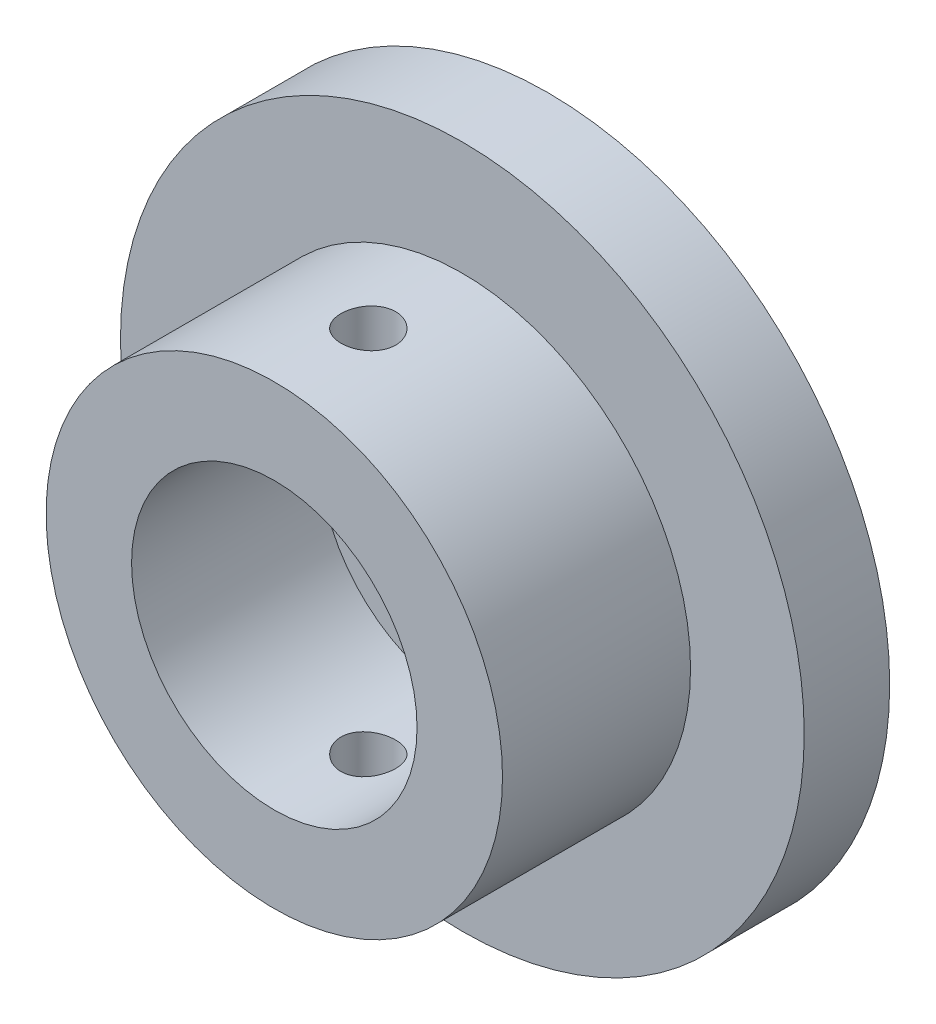
ISO-10303-21;
HEADER;
FILE_DESCRIPTION(('STEP AP214'),'2;1');
FILE_NAME('part.step','',(''),(''),'','','');
FILE_SCHEMA(('AUTOMOTIVE_DESIGN { 1 0 10303 214 1 1 1 1 }'));
ENDSEC;
DATA;
#1=APPLICATION_CONTEXT('core data for automotive mechanical design processes');
#2=APPLICATION_PROTOCOL_DEFINITION('international standard','automotive_design',2000,#1);
#3=PRODUCT_CONTEXT('',#1,'mechanical');
#4=PRODUCT('Part','Part','',(#3));
#5=PRODUCT_RELATED_PRODUCT_CATEGORY('part','',(#4));
#6=PRODUCT_DEFINITION_FORMATION('','',#4);
#7=PRODUCT_DEFINITION_CONTEXT('part definition',#1,'design');
#8=PRODUCT_DEFINITION('design','',#6,#7);
#9=PRODUCT_DEFINITION_SHAPE('','',#8);
#10=(LENGTH_UNIT() NAMED_UNIT(*) SI_UNIT(.MILLI.,.METRE.));
#11=(NAMED_UNIT(*) PLANE_ANGLE_UNIT() SI_UNIT($,.RADIAN.));
#12=(NAMED_UNIT(*) SI_UNIT($,.STERADIAN.) SOLID_ANGLE_UNIT());
#13=UNCERTAINTY_MEASURE_WITH_UNIT(LENGTH_MEASURE(1.E-05),#10,'distance_accuracy_value','');
#14=(GEOMETRIC_REPRESENTATION_CONTEXT(3) GLOBAL_UNCERTAINTY_ASSIGNED_CONTEXT((#13)) GLOBAL_UNIT_ASSIGNED_CONTEXT((#10,
#11,#12)) REPRESENTATION_CONTEXT('',''));
#15=CARTESIAN_POINT('',(0.,0.,0.));
#16=DIRECTION('',(0.,0.,1.));
#17=DIRECTION('',(1.,0.,0.));
#18=AXIS2_PLACEMENT_3D('',#15,#16,#17);
#19=CARTESIAN_POINT('',(0.,0.,5.));
#20=DIRECTION('',(0.,0.,-1.));
#21=DIRECTION('',(-1.,0.,0.));
#22=AXIS2_PLACEMENT_3D('',#19,#20,#21);
#23=CYLINDRICAL_SURFACE('',#22,20.);
#24=CARTESIAN_POINT('',(0.,0.,5.));
#25=DIRECTION('',(0.,0.,1.));
#26=DIRECTION('',(1.,0.,0.));
#27=AXIS2_PLACEMENT_3D('',#24,#25,#26);
#28=CIRCLE('',#27,20.);
#29=CARTESIAN_POINT('',(20.,0.,5.));
#30=VERTEX_POINT('',#29);
#31=EDGE_CURVE('E50',#30,#30,#28,.T.);
#32=ORIENTED_EDGE('',*,*,#31,.F.);
#33=EDGE_LOOP('',(#32));
#34=FACE_BOUND('',#33,.T.);
#35=CARTESIAN_POINT('',(0.,0.,0.));
#36=DIRECTION('',(0.,0.,1.));
#37=DIRECTION('',(1.,0.,0.));
#38=AXIS2_PLACEMENT_3D('',#35,#36,#37);
#39=CIRCLE('',#38,20.);
#40=CARTESIAN_POINT('',(20.,0.,0.));
#41=VERTEX_POINT('',#40);
#42=EDGE_CURVE('E56',#41,#41,#39,.T.);
#43=ORIENTED_EDGE('',*,*,#42,.T.);
#44=EDGE_LOOP('',(#43));
#45=FACE_BOUND('',#44,.T.);
#46=ADVANCED_FACE('F37',(#34,#45),#23,.T.);
#47=CARTESIAN_POINT('',(0.,0.,5.));
#48=DIRECTION('',(0.,0.,1.));
#49=DIRECTION('',(1.,0.,0.));
#50=AXIS2_PLACEMENT_3D('',#47,#48,#49);
#51=PLANE('',#50);
#52=CARTESIAN_POINT('',(0.,0.,5.));
#53=DIRECTION('',(0.,0.,1.));
#54=DIRECTION('',(1.,0.,0.));
#55=AXIS2_PLACEMENT_3D('',#52,#53,#54);
#56=CIRCLE('',#55,13.35);
#57=CARTESIAN_POINT('',(13.35,0.,5.));
#58=VERTEX_POINT('',#57);
#59=EDGE_CURVE('E129',#58,#58,#56,.T.);
#60=ORIENTED_EDGE('',*,*,#59,.F.);
#61=EDGE_LOOP('',(#60));
#62=FACE_BOUND('',#61,.T.);
#63=ORIENTED_EDGE('',*,*,#31,.T.);
#64=EDGE_LOOP('',(#63));
#65=FACE_BOUND('',#64,.T.);
#66=ADVANCED_FACE('F103',(#62,#65),#51,.T.);
#67=CARTESIAN_POINT('',(0.,0.,0.));
#68=DIRECTION('',(0.,0.,1.));
#69=DIRECTION('',(1.,0.,0.));
#70=AXIS2_PLACEMENT_3D('',#67,#68,#69);
#71=PLANE('',#70);
#72=CARTESIAN_POINT('',(0.,0.,0.));
#73=DIRECTION('',(0.,0.,-1.));
#74=DIRECTION('',(-1.,0.,0.));
#75=AXIS2_PLACEMENT_3D('',#72,#73,#74);
#76=CIRCLE('',#75,12.9034879005639);
#77=CARTESIAN_POINT('',(-12.9034879005639,0.,0.));
#78=VERTEX_POINT('',#77);
#79=EDGE_CURVE('E91',#78,#78,#76,.T.);
#80=ORIENTED_EDGE('',*,*,#79,.F.);
#81=EDGE_LOOP('',(#80));
#82=FACE_BOUND('',#81,.T.);
#83=ORIENTED_EDGE('',*,*,#42,.F.);
#84=EDGE_LOOP('',(#83));
#85=FACE_BOUND('',#84,.T.);
#86=ADVANCED_FACE('F106',(#82,#85),#71,.F.);
#87=CARTESIAN_POINT('',(0.,0.,16.));
#88=DIRECTION('',(0.,0.,1.));
#89=DIRECTION('',(1.,0.,0.));
#90=AXIS2_PLACEMENT_3D('',#87,#88,#89);
#91=PLANE('',#90);
#92=CARTESIAN_POINT('',(0.,0.,16.));
#93=DIRECTION('',(0.,0.,1.));
#94=DIRECTION('',(1.,0.,0.));
#95=AXIS2_PLACEMENT_3D('',#92,#93,#94);
#96=CIRCLE('',#95,13.35);
#97=CARTESIAN_POINT('',(13.35,0.,16.));
#98=VERTEX_POINT('',#97);
#99=EDGE_CURVE('E126',#98,#98,#96,.T.);
#100=ORIENTED_EDGE('',*,*,#99,.T.);
#101=EDGE_LOOP('',(#100));
#102=FACE_BOUND('',#101,.T.);
#103=CARTESIAN_POINT('',(0.,0.,16.));
#104=DIRECTION('',(0.,0.,1.));
#105=DIRECTION('',(1.,0.,0.));
#106=AXIS2_PLACEMENT_3D('',#103,#104,#105);
#107=CIRCLE('',#106,8.35);
#108=CARTESIAN_POINT('',(8.35,0.,16.));
#109=VERTEX_POINT('',#108);
#110=EDGE_CURVE('E134',#109,#109,#107,.T.);
#111=ORIENTED_EDGE('',*,*,#110,.F.);
#112=EDGE_LOOP('',(#111));
#113=FACE_BOUND('',#112,.T.);
#114=ADVANCED_FACE('F101',(#102,#113),#91,.T.);
#115=CARTESIAN_POINT('',(0.,0.,16.));
#116=DIRECTION('',(0.,0.,-1.));
#117=DIRECTION('',(-1.,0.,0.));
#118=AXIS2_PLACEMENT_3D('',#115,#116,#117);
#119=CYLINDRICAL_SURFACE('',#118,13.35);
#120=CARTESIAN_POINT('',(0.,-13.35,12.1));
#121=CARTESIAN_POINT('',(0.08952834844518,-13.3499987936479,12.0999961786977));
#122=CARTESIAN_POINT('',(0.179113370539221,-13.3490898771944,12.0924603046261));
#123=CARTESIAN_POINT('',(0.355792629559645,-13.3455514505529,12.0625160181489));
#124=CARTESIAN_POINT('',(0.442884131949133,-13.3429201216303,12.0400918845319));
#125=CARTESIAN_POINT('',(0.611992819855896,-13.3362334372356,11.9810394637834));
#126=CARTESIAN_POINT('',(0.694013301746952,-13.3321790185254,11.9444205188635));
#127=CARTESIAN_POINT('',(0.850728374997732,-13.3230976288697,11.8580378932761));
#128=CARTESIAN_POINT('',(0.925424264355072,-13.3180708307114,11.8082765473789));
#129=CARTESIAN_POINT('',(1.06576531991648,-13.3075777851692,11.6967512367392));
#130=CARTESIAN_POINT('',(1.13136794053488,-13.302109649709,11.6349339058635));
#131=CARTESIAN_POINT('',(1.25129397541818,-13.2913655313018,11.5011658563929));
#132=CARTESIAN_POINT('',(1.30561682723396,-13.2860895579475,11.4292146327864));
#133=CARTESIAN_POINT('',(1.40159821894524,-13.27630842812,11.2769467801532));
#134=CARTESIAN_POINT('',(1.44321717324154,-13.2718056997797,11.1966050291177));
#135=CARTESIAN_POINT('',(1.51235657306163,-13.264105512013,11.0300097556512));
#136=CARTESIAN_POINT('',(1.53987751106424,-13.2609080069927,10.9437564398454));
#137=CARTESIAN_POINT('',(1.57991100120593,-13.2561981625569,10.7682265849757));
#138=CARTESIAN_POINT('',(1.59249515183172,-13.2546777864368,10.67896659491));
#139=CARTESIAN_POINT('',(1.60251934982912,-13.2534696846962,10.4995896545425));
#140=CARTESIAN_POINT('',(1.59995995875207,-13.25378189112,10.409472736141));
#141=CARTESIAN_POINT('',(1.57982855037575,-13.2561963259811,10.231437786817));
#142=CARTESIAN_POINT('',(1.56233524524869,-13.2582891690239,10.1435107101426));
#143=CARTESIAN_POINT('',(1.51295531464243,-13.2640144259593,9.97184926574479));
#144=CARTESIAN_POINT('',(1.48106841911193,-13.2676468687377,9.88811497671881));
#145=CARTESIAN_POINT('',(1.40372134750049,-13.2760527221886,9.72697056544406));
#146=CARTESIAN_POINT('',(1.35822680642899,-13.2808290154006,9.64957709440325));
#147=CARTESIAN_POINT('',(1.25498047373705,-13.290982133195,9.50349364031692));
#148=CARTESIAN_POINT('',(1.19722816654972,-13.2963589830326,9.43480402355337));
#149=CARTESIAN_POINT('',(1.07066869011866,-13.3071491293924,9.30762113501134));
#150=CARTESIAN_POINT('',(1.00179364519536,-13.3125624405245,9.24919538621962));
#151=CARTESIAN_POINT('',(0.855177949699856,-13.3227835587139,9.14472393664219));
#152=CARTESIAN_POINT('',(0.777437281392028,-13.3275913645598,9.09867826062336));
#153=CARTESIAN_POINT('',(0.615246222507605,-13.336062410831,9.0202745932169));
#154=CARTESIAN_POINT('',(0.530793856240847,-13.3397253126595,8.98792065005772));
#155=CARTESIAN_POINT('',(0.35760150731483,-13.3454907006994,8.93787153684925));
#156=CARTESIAN_POINT('',(0.268861709272369,-13.3475932540358,8.9201757362147));
#157=CARTESIAN_POINT('',(0.0901975327176722,-13.3499923443044,8.90003232641368));
#158=CARTESIAN_POINT('',(0.000283787374595168,-13.350299902173,8.89749166539563));
#159=CARTESIAN_POINT('',(-0.178688197782501,-13.3491040587092,8.90748535090659));
#160=CARTESIAN_POINT('',(-0.267746454279792,-13.347600692765,8.92001940285281));
#161=CARTESIAN_POINT('',(-0.442206199993488,-13.3429588230607,8.9597294377028));
#162=CARTESIAN_POINT('',(-0.527617890050847,-13.339825255133,8.98686123083461));
#163=CARTESIAN_POINT('',(-0.692678655190031,-13.332273956285,9.0549507525386));
#164=CARTESIAN_POINT('',(-0.772327549000742,-13.3278561849915,9.09590891579552));
#165=CARTESIAN_POINT('',(-0.924018513346013,-13.3182018770222,9.19071491835944));
#166=CARTESIAN_POINT('',(-0.996022586213507,-13.3129615445552,9.24462316140195));
#167=CARTESIAN_POINT('',(-1.12999382556217,-13.3022606829901,9.36371335539218));
#168=CARTESIAN_POINT('',(-1.19196062671689,-13.2968001458862,9.42889571650537));
#169=CARTESIAN_POINT('',(-1.30442688755913,-13.2862404921048,9.56909289694407));
#170=CARTESIAN_POINT('',(-1.35486479964829,-13.2811434108184,9.64415726526891));
#171=CARTESIAN_POINT('',(-1.44241681039877,-13.2719207363343,9.80174634321919));
#172=CARTESIAN_POINT('',(-1.47953115778828,-13.2677951250014,9.8842709135394));
#173=CARTESIAN_POINT('',(-1.53928209137435,-13.2609961505335,10.0542364503129));
#174=CARTESIAN_POINT('',(-1.56195380666959,-13.2583192660384,10.1416649203907));
#175=CARTESIAN_POINT('',(-1.59228923997413,-13.2547105649497,10.3191219466423));
#176=CARTESIAN_POINT('',(-1.59995359545786,-13.2537786742332,10.409150392211));
#177=CARTESIAN_POINT('',(-1.60004569183104,-13.2537675073664,10.5886396288879));
#178=CARTESIAN_POINT('',(-1.59257012039954,-13.2546764749949,10.6781003851194));
#179=CARTESIAN_POINT('',(-1.56279886218971,-13.2582193796073,10.8544844285159));
#180=CARTESIAN_POINT('',(-1.54050316998635,-13.2608533172227,10.941407714752));
#181=CARTESIAN_POINT('',(-1.48175402551803,-13.2675458325214,11.1102393004767));
#182=CARTESIAN_POINT('',(-1.44530483318323,-13.2716039815093,11.1921491003488));
#183=CARTESIAN_POINT('',(-1.35929290729016,-13.2806884153047,11.3487050504849));
#184=CARTESIAN_POINT('',(-1.30973006202858,-13.2857147083589,11.4233511388686));
#185=CARTESIAN_POINT('',(-1.19853784991209,-13.2962075714811,11.5637553966588));
#186=CARTESIAN_POINT('',(-1.13683638458679,-13.301676651347,11.6294562840468));
#187=CARTESIAN_POINT('',(-1.00326774659578,-13.3124165006522,11.7496095636469));
#188=CARTESIAN_POINT('',(-0.931398172766001,-13.3176872228766,11.8040592914419));
#189=CARTESIAN_POINT('',(-0.779246629750587,-13.3274566949094,11.9003250152497));
#190=CARTESIAN_POINT('',(-0.698936046880937,-13.3319526730621,11.9420960427533));
#191=CARTESIAN_POINT('',(-0.532432727268812,-13.3396376620964,12.0115002347943));
#192=CARTESIAN_POINT('',(-0.446246554249135,-13.3428281043836,12.0391488915768));
#193=CARTESIAN_POINT('',(-0.299670591712782,-13.3467661149264,12.0728430607927));
#194=CARTESIAN_POINT('',(-0.240208159709908,-13.3479729709225,12.0830124405512));
#195=CARTESIAN_POINT('',(-0.120505708496943,-13.349590316865,12.0965921740643));
#196=CARTESIAN_POINT('',(-0.0602656944063414,-13.3500008120517,12.1000025722963));
#197=CARTESIAN_POINT('',(0.,-13.35,12.1));
#198=B_SPLINE_CURVE_WITH_KNOTS('',3,(#120,#121,#122,#123,#124,#125,#126,#127,#128,#129,#130,
#131,#132,#133,#134,#135,#136,#137,#138,#139,#140,#141,#142,#143,#144,#145,#146,#147,#148,#149,
#150,#151,#152,#153,#154,#155,#156,#157,#158,#159,#160,#161,#162,#163,#164,#165,#166,#167,#168,
#169,#170,#171,#172,#173,#174,#175,#176,#177,#178,#179,#180,#181,#182,#183,#184,#185,#186,#187,
#188,#189,#190,#191,#192,#193,#194,#195,#196,#197),.UNSPECIFIED.,.T.,.F.,(4,2,2,2,2,2,2,2,2,2,2,
2,2,2,2,2,2,2,2,2,2,2,2,2,2,2,2,2,2,2,2,2,2,2,2,2,2,2,4),(0.,0.268364928420798,
0.537013687606326,0.805485936943893,1.07391052376643,1.34355143222059,1.61320578269599,
1.8836920001261,2.15416876815464,2.42334371962502,2.69250868963865,2.96026366946738,
3.22802367310044,3.49646567547782,3.76491897087897,4.03507710135868,4.30523577229761,
4.57547426521419,4.84570113201509,5.11426709647259,5.38282781282827,5.65058008843578,
5.91834078264235,6.18737552273611,6.45642005268497,6.7268689857465,6.99731286972582,
7.26709641047308,7.53686849125378,7.80492316740225,8.07297794167447,8.34095209909425,
8.60892853921639,8.87854751381376,9.14823026461351,9.41885863394076,9.68918948279137,
9.86983958384796,10.0504884961362),.UNSPECIFIED.);
#199=CARTESIAN_POINT('',(0.,-13.35,12.1));
#200=VERTEX_POINT('',#199);
#201=EDGE_CURVE('E90',#200,#200,#198,.T.);
#202=ORIENTED_EDGE('',*,*,#201,.T.);
#203=EDGE_LOOP('',(#202));
#204=FACE_BOUND('',#203,.T.);
#205=CARTESIAN_POINT('',(0.,13.35,12.1));
#206=CARTESIAN_POINT('',(-0.0895283484451774,13.3499987936479,12.0999961786977));
#207=CARTESIAN_POINT('',(-0.179113370539218,13.3490898771944,12.0924603046261));
#208=CARTESIAN_POINT('',(-0.355792629559642,13.3455514505529,12.0625160181489));
#209=CARTESIAN_POINT('',(-0.44288413194913,13.3429201216303,12.0400918845319));
#210=CARTESIAN_POINT('',(-0.611992819855893,13.3362334372356,11.9810394637834));
#211=CARTESIAN_POINT('',(-0.694013301746949,13.3321790185254,11.9444205188635));
#212=CARTESIAN_POINT('',(-0.850728374997729,13.3230976288697,11.8580378932761));
#213=CARTESIAN_POINT('',(-0.925424264355069,13.3180708307114,11.8082765473789));
#214=CARTESIAN_POINT('',(-1.06576531991648,13.3075777851692,11.6967512367392));
#215=CARTESIAN_POINT('',(-1.13136794053488,13.302109649709,11.6349339058635));
#216=CARTESIAN_POINT('',(-1.25129397541818,13.2913655313018,11.5011658563929));
#217=CARTESIAN_POINT('',(-1.30561682723396,13.2860895579475,11.4292146327864));
#218=CARTESIAN_POINT('',(-1.40159821894524,13.27630842812,11.2769467801532));
#219=CARTESIAN_POINT('',(-1.44321717324154,13.2718056997797,11.1966050291177));
#220=CARTESIAN_POINT('',(-1.51235657306162,13.264105512013,11.0300097556512));
#221=CARTESIAN_POINT('',(-1.53987751106423,13.2609080069927,10.9437564398454));
#222=CARTESIAN_POINT('',(-1.57991100120592,13.2561981625569,10.7682265849757));
#223=CARTESIAN_POINT('',(-1.59249515183171,13.2546777864368,10.67896659491));
#224=CARTESIAN_POINT('',(-1.60251934982912,13.2534696846962,10.4995896545425));
#225=CARTESIAN_POINT('',(-1.59995995875207,13.25378189112,10.409472736141));
#226=CARTESIAN_POINT('',(-1.57982855037575,13.2561963259811,10.231437786817));
#227=CARTESIAN_POINT('',(-1.56233524524869,13.2582891690239,10.1435107101426));
#228=CARTESIAN_POINT('',(-1.51295531464243,13.2640144259593,9.97184926574479));
#229=CARTESIAN_POINT('',(-1.48106841911193,13.2676468687377,9.88811497671881));
#230=CARTESIAN_POINT('',(-1.40372134750049,13.2760527221886,9.72697056544406));
#231=CARTESIAN_POINT('',(-1.35822680642899,13.2808290154006,9.64957709440325));
#232=CARTESIAN_POINT('',(-1.25498047373705,13.290982133195,9.50349364031692));
#233=CARTESIAN_POINT('',(-1.19722816654972,13.2963589830326,9.43480402355337));
#234=CARTESIAN_POINT('',(-1.07066869011865,13.3071491293924,9.30762113501134));
#235=CARTESIAN_POINT('',(-1.00179364519535,13.3125624405245,9.24919538621962));
#236=CARTESIAN_POINT('',(-0.855177949699854,13.3227835587139,9.14472393664219));
#237=CARTESIAN_POINT('',(-0.777437281392025,13.3275913645598,9.09867826062336));
#238=CARTESIAN_POINT('',(-0.615246222507603,13.336062410831,9.0202745932169));
#239=CARTESIAN_POINT('',(-0.530793856240844,13.3397253126595,8.98792065005772));
#240=CARTESIAN_POINT('',(-0.357601507314827,13.3454907006994,8.93787153684925));
#241=CARTESIAN_POINT('',(-0.268861709272366,13.3475932540358,8.9201757362147));
#242=CARTESIAN_POINT('',(-0.0901975327176695,13.3499923443044,8.90003232641368));
#243=CARTESIAN_POINT('',(-0.000283787374592471,13.350299902173,8.89749166539563));
#244=CARTESIAN_POINT('',(0.178688197782503,13.3491040587092,8.90748535090659));
#245=CARTESIAN_POINT('',(0.267746454279794,13.347600692765,8.92001940285281));
#246=CARTESIAN_POINT('',(0.44220619999349,13.3429588230607,8.9597294377028));
#247=CARTESIAN_POINT('',(0.52761789005085,13.339825255133,8.98686123083461));
#248=CARTESIAN_POINT('',(0.692678655190034,13.332273956285,9.0549507525386));
#249=CARTESIAN_POINT('',(0.772327549000745,13.3278561849915,9.09590891579552));
#250=CARTESIAN_POINT('',(0.924018513346016,13.3182018770222,9.19071491835944));
#251=CARTESIAN_POINT('',(0.996022586213509,13.3129615445552,9.24462316140195));
#252=CARTESIAN_POINT('',(1.12999382556218,13.3022606829901,9.36371335539218));
#253=CARTESIAN_POINT('',(1.19196062671689,13.2968001458861,9.42889571650537));
#254=CARTESIAN_POINT('',(1.30442688755914,13.2862404921048,9.56909289694407));
#255=CARTESIAN_POINT('',(1.3548647996483,13.2811434108184,9.64415726526891));
#256=CARTESIAN_POINT('',(1.44241681039877,13.2719207363343,9.80174634321919));
#257=CARTESIAN_POINT('',(1.47953115778828,13.2677951250014,9.8842709135394));
#258=CARTESIAN_POINT('',(1.53928209137435,13.2609961505335,10.0542364503129));
#259=CARTESIAN_POINT('',(1.56195380666959,13.2583192660384,10.1416649203907));
#260=CARTESIAN_POINT('',(1.59228923997414,13.2547105649497,10.3191219466423));
#261=CARTESIAN_POINT('',(1.59995359545787,13.2537786742332,10.409150392211));
#262=CARTESIAN_POINT('',(1.60004569183104,13.2537675073664,10.5886396288879));
#263=CARTESIAN_POINT('',(1.59257012039954,13.2546764749949,10.6781003851194));
#264=CARTESIAN_POINT('',(1.56279886218972,13.2582193796073,10.8544844285159));
#265=CARTESIAN_POINT('',(1.54050316998636,13.2608533172227,10.941407714752));
#266=CARTESIAN_POINT('',(1.48175402551803,13.2675458325214,11.1102393004767));
#267=CARTESIAN_POINT('',(1.44530483318323,13.2716039815093,11.1921491003488));
#268=CARTESIAN_POINT('',(1.35929290729017,13.2806884153047,11.3487050504849));
#269=CARTESIAN_POINT('',(1.30973006202859,13.2857147083589,11.4233511388686));
#270=CARTESIAN_POINT('',(1.19853784991209,13.2962075714811,11.5637553966588));
#271=CARTESIAN_POINT('',(1.13683638458679,13.301676651347,11.6294562840468));
#272=CARTESIAN_POINT('',(1.00326774659579,13.3124165006522,11.7496095636469));
#273=CARTESIAN_POINT('',(0.931398172766002,13.3176872228766,11.8040592914419));
#274=CARTESIAN_POINT('',(0.779246629750589,13.3274566949094,11.9003250152497));
#275=CARTESIAN_POINT('',(0.698936046880938,13.3319526730621,11.9420960427533));
#276=CARTESIAN_POINT('',(0.532432727268814,13.3396376620964,12.0115002347943));
#277=CARTESIAN_POINT('',(0.446246554249137,13.3428281043836,12.0391488915768));
#278=CARTESIAN_POINT('',(0.299670591712784,13.3467661149264,12.0728430607927));
#279=CARTESIAN_POINT('',(0.240208159709909,13.3479729709225,12.0830124405512));
#280=CARTESIAN_POINT('',(0.120505708496944,13.349590316865,12.0965921740643));
#281=CARTESIAN_POINT('',(0.0602656944063436,13.3500008120517,12.1000025722963));
#282=CARTESIAN_POINT('',(0.,13.35,12.1));
#283=B_SPLINE_CURVE_WITH_KNOTS('',3,(#205,#206,#207,#208,#209,#210,#211,#212,#213,#214,#215,
#216,#217,#218,#219,#220,#221,#222,#223,#224,#225,#226,#227,#228,#229,#230,#231,#232,#233,#234,
#235,#236,#237,#238,#239,#240,#241,#242,#243,#244,#245,#246,#247,#248,#249,#250,#251,#252,#253,
#254,#255,#256,#257,#258,#259,#260,#261,#262,#263,#264,#265,#266,#267,#268,#269,#270,#271,#272,
#273,#274,#275,#276,#277,#278,#279,#280,#281,#282),.UNSPECIFIED.,.T.,.F.,(4,2,2,2,2,2,2,2,2,2,2,
2,2,2,2,2,2,2,2,2,2,2,2,2,2,2,2,2,2,2,2,2,2,2,2,2,2,2,4),(0.,0.268364928420798,
0.537013687606326,0.805485936943893,1.07391052376643,1.34355143222059,1.61320578269599,
1.8836920001261,2.15416876815464,2.42334371962502,2.69250868963865,2.96026366946738,
3.22802367310044,3.49646567547782,3.76491897087897,4.03507710135868,4.30523577229761,
4.57547426521419,4.84570113201509,5.11426709647259,5.38282781282827,5.65058008843578,
5.91834078264235,6.18737552273611,6.45642005268497,6.7268689857465,6.99731286972583,
7.26709641047308,7.53686849125378,7.80492316740225,8.07297794167447,8.34095209909425,
8.6089285392164,8.87854751381376,9.14823026461351,9.41885863394076,9.68918948279138,
9.86983958384796,10.0504884961362),.UNSPECIFIED.);
#284=CARTESIAN_POINT('',(0.,13.35,12.1));
#285=VERTEX_POINT('',#284);
#286=EDGE_CURVE('E82',#285,#285,#283,.T.);
#287=ORIENTED_EDGE('',*,*,#286,.T.);
#288=EDGE_LOOP('',(#287));
#289=FACE_BOUND('',#288,.T.);
#290=ORIENTED_EDGE('',*,*,#99,.F.);
#291=EDGE_LOOP('',(#290));
#292=FACE_BOUND('',#291,.T.);
#293=ORIENTED_EDGE('',*,*,#59,.T.);
#294=EDGE_LOOP('',(#293));
#295=FACE_BOUND('',#294,.T.);
#296=ADVANCED_FACE('F97',(#204,#289,#292,#295),#119,.T.);
#297=CARTESIAN_POINT('',(0.,0.,16.));
#298=DIRECTION('',(0.,0.,-1.));
#299=DIRECTION('',(-1.,0.,0.));
#300=AXIS2_PLACEMENT_3D('',#297,#298,#299);
#301=CYLINDRICAL_SURFACE('',#300,8.35);
#302=CARTESIAN_POINT('',(0.,-8.35,12.1));
#303=CARTESIAN_POINT('',(0.088999920412338,-8.34999837671798,12.099996638553));
#304=CARTESIAN_POINT('',(0.178043169954566,-8.34856240490577,12.0925489829305));
#305=CARTESIAN_POINT('',(0.353617996851197,-8.34297246864219,12.0629757627956));
#306=CARTESIAN_POINT('',(0.440147432574108,-8.33881625373756,12.0408380450051));
#307=CARTESIAN_POINT('',(0.608130266925262,-8.32825049076629,11.9825894593916));
#308=CARTESIAN_POINT('',(0.689588259758564,-8.32184301812952,11.9464914584486));
#309=CARTESIAN_POINT('',(0.845284689432195,-8.3074734148694,11.8613840782446));
#310=CARTESIAN_POINT('',(0.919523660016036,-8.2995113993134,11.8123756545202));
#311=CARTESIAN_POINT('',(1.05960823569186,-8.28279958916938,11.7021894987275));
#312=CARTESIAN_POINT('',(1.12535071545626,-8.27404198190622,11.6408818304469));
#313=CARTESIAN_POINT('',(1.2456837220506,-8.25678363879897,11.5081169355528));
#314=CARTESIAN_POINT('',(1.30027342575777,-8.24828292195392,11.4366589604625));
#315=CARTESIAN_POINT('',(1.39718344110446,-8.23242479224726,11.2848888842238));
#316=CARTESIAN_POINT('',(1.43939824239803,-8.225077446011,11.2045082667941));
#317=CARTESIAN_POINT('',(1.50968453374201,-8.21246831940417,11.0376313307637));
#318=CARTESIAN_POINT('',(1.53775730035106,-8.20720635080203,10.9511355649628));
#319=CARTESIAN_POINT('',(1.57863043704444,-8.19944252786857,10.7755890527733));
#320=CARTESIAN_POINT('',(1.59161100789495,-8.19690813407764,10.6865817310867));
#321=CARTESIAN_POINT('',(1.60249074083646,-8.19478836277369,10.5076192447866));
#322=CARTESIAN_POINT('',(1.60039131626055,-8.19520270889769,10.4176641697878));
#323=CARTESIAN_POINT('',(1.58131663553811,-8.19890399567156,10.2406693362248));
#324=CARTESIAN_POINT('',(1.56454682405781,-8.20215126227161,10.1536064843604));
#325=CARTESIAN_POINT('',(1.51693118667707,-8.21109013859066,9.9835532816138));
#326=CARTESIAN_POINT('',(1.48608473863151,-8.21678185634642,9.90056311091135));
#327=CARTESIAN_POINT('',(1.41099206390459,-8.2300095013322,9.74041285983158));
#328=CARTESIAN_POINT('',(1.36666337439718,-8.23755672152345,9.66329241666184));
#329=CARTESIAN_POINT('',(1.26592282133831,-8.25363759316322,9.51750723087783));
#330=CARTESIAN_POINT('',(1.20950967894696,-8.26217134896806,9.44884338439691));
#331=CARTESIAN_POINT('',(1.08509639451126,-8.27943630331606,9.32073399544455));
#332=CARTESIAN_POINT('',(1.01692065016761,-8.28816843828946,9.26145898343637));
#333=CARTESIAN_POINT('',(0.871503710083373,-8.3047171889267,9.15516078213957));
#334=CARTESIAN_POINT('',(0.794262415640826,-8.3125337946208,9.10813772626315));
#335=CARTESIAN_POINT('',(0.632725367371713,-8.32638762045492,9.0276510597155));
#336=CARTESIAN_POINT('',(0.548420274870845,-8.33242243576898,8.99420575189077));
#337=CARTESIAN_POINT('',(0.375246985053417,-8.34201425025046,8.94199941271068));
#338=CARTESIAN_POINT('',(0.286379295526278,-8.34557152451412,8.92323675102451));
#339=CARTESIAN_POINT('',(0.108070023162961,-8.34976949207204,8.90116698054494));
#340=CARTESIAN_POINT('',(0.0186583533189865,-8.35045425636979,8.89762630970143));
#341=CARTESIAN_POINT('',(-0.159479275013742,-8.34895200457526,8.90547371249381));
#342=CARTESIAN_POINT('',(-0.248205268516609,-8.34676513611094,8.91686101869627));
#343=CARTESIAN_POINT('',(-0.421708027256872,-8.33979282495598,8.95404699091678));
#344=CARTESIAN_POINT('',(-0.506511172410959,-8.33502879769411,8.97972693933648));
#345=CARTESIAN_POINT('',(-0.670608206968542,-8.32343421571049,9.04464036039672));
#346=CARTESIAN_POINT('',(-0.749901709058058,-8.31660351588726,9.0838747847272));
#347=CARTESIAN_POINT('',(-0.901721601237373,-8.30152337442907,9.17529660944378));
#348=CARTESIAN_POINT('',(-0.974160915357745,-8.29325870198987,9.22762604850601));
#349=CARTESIAN_POINT('',(-1.1093138798415,-8.27626551513524,9.34356091256803));
#350=CARTESIAN_POINT('',(-1.17202657772992,-8.26753695540607,9.4071674405668));
#351=CARTESIAN_POINT('',(-1.28683813149658,-8.25045278966988,9.54491023660484));
#352=CARTESIAN_POINT('',(-1.33877728330101,-8.24210405690218,9.61918061757127));
#353=CARTESIAN_POINT('',(-1.42944294129684,-8.22686545533228,9.77552913197211));
#354=CARTESIAN_POINT('',(-1.46816995151533,-8.21997553088212,9.85760696740886));
#355=CARTESIAN_POINT('',(-1.53108827864681,-8.20848909682197,10.0268437135403));
#356=CARTESIAN_POINT('',(-1.55535146885927,-8.20388126675669,10.1139750989029));
#357=CARTESIAN_POINT('',(-1.58887393343417,-8.19745546664984,10.2911748190823));
#358=CARTESIAN_POINT('',(-1.59813498480968,-8.19563716618804,10.3812428047676));
#359=CARTESIAN_POINT('',(-1.6013287760233,-8.19501357400432,10.560158132435));
#360=CARTESIAN_POINT('',(-1.59551357064302,-8.19615873656897,10.6490008994876));
#361=CARTESIAN_POINT('',(-1.56927319302119,-8.20122290683066,10.8244172460686));
#362=CARTESIAN_POINT('',(-1.54884811742649,-8.20514189617837,10.910990840604));
#363=CARTESIAN_POINT('',(-1.49407612783588,-8.21529086511451,11.0792677442711));
#364=CARTESIAN_POINT('',(-1.45975767685212,-8.2215161177185,11.1609806212307));
#365=CARTESIAN_POINT('',(-1.37820110436923,-8.23557931144187,11.3175287484828));
#366=CARTESIAN_POINT('',(-1.33096201446157,-8.24341737343123,11.3923634826931));
#367=CARTESIAN_POINT('',(-1.22403378469916,-8.25997612354642,11.5342912244519));
#368=CARTESIAN_POINT('',(-1.16416165696249,-8.26870868846733,11.6012450075807));
#369=CARTESIAN_POINT('',(-1.03404728203711,-8.28598482897628,11.7242393421252));
#370=CARTESIAN_POINT('',(-0.963802656128361,-8.29452836069528,11.7802773833844));
#371=CARTESIAN_POINT('',(-0.814139702476404,-8.3105588527926,11.8803469256546));
#372=CARTESIAN_POINT('',(-0.734640822720126,-8.31803504487452,11.9242597380767));
#373=CARTESIAN_POINT('',(-0.56927441498169,-8.33098309751287,11.9980347500145));
#374=CARTESIAN_POINT('',(-0.483412877295726,-8.33645681523278,12.027909975822));
#375=CARTESIAN_POINT('',(-0.331098108478749,-8.34368411722474,12.0667857920298));
#376=CARTESIAN_POINT('',(-0.265528024217639,-8.34603904201679,12.0792195391437));
#377=CARTESIAN_POINT('',(-0.133313378124885,-8.34919757014,12.0958277889749));
#378=CARTESIAN_POINT('',(-0.0666688457878886,-8.35000121598242,12.1000025180224));
#379=CARTESIAN_POINT('',(0.,-8.35,12.1));
#380=B_SPLINE_CURVE_WITH_KNOTS('',3,(#302,#303,#304,#305,#306,#307,#308,#309,#310,#311,#312,
#313,#314,#315,#316,#317,#318,#319,#320,#321,#322,#323,#324,#325,#326,#327,#328,#329,#330,#331,
#332,#333,#334,#335,#336,#337,#338,#339,#340,#341,#342,#343,#344,#345,#346,#347,#348,#349,#350,
#351,#352,#353,#354,#355,#356,#357,#358,#359,#360,#361,#362,#363,#364,#365,#366,#367,#368,#369,
#370,#371,#372,#373,#374,#375,#376,#377,#378,#379),.UNSPECIFIED.,.T.,.F.,(4,2,2,2,2,2,2,2,2,2,2,
2,2,2,2,2,2,2,2,2,2,2,2,2,2,2,2,2,2,2,2,2,2,2,2,2,2,2,4),(0.,0.266755922641982,
0.533732811508008,0.800464217954758,1.06717588840782,1.3368696127265,1.60658323441526,
1.87853371263834,2.1504596383147,2.41910429900525,2.68772378200666,2.95264066233248,
3.21756925232387,3.48415200015084,3.75076297310503,4.02176686755232,4.29277371285183,
4.56414467279092,4.83548549597961,5.10264773818341,5.36979624636324,5.63475818546357,
5.89973873191361,6.16772849195322,6.43574447823537,6.7074870784977,6.97921931095168,
7.24958975143671,7.51992816402523,7.78577613719329,8.05162235174689,8.31692666786249,
8.58225087412411,8.8517205011012,9.12125202167133,9.39333520362083,9.66516540270863,
9.86499475950792,10.064818640105),.UNSPECIFIED.);
#381=CARTESIAN_POINT('',(0.,-8.35,12.1));
#382=VERTEX_POINT('',#381);
#383=EDGE_CURVE('E40',#382,#382,#380,.T.);
#384=ORIENTED_EDGE('',*,*,#383,.F.);
#385=EDGE_LOOP('',(#384));
#386=FACE_BOUND('',#385,.T.);
#387=CARTESIAN_POINT('',(0.,8.35,12.1));
#388=CARTESIAN_POINT('',(-0.0889999204123354,8.34999837671798,12.099996638553));
#389=CARTESIAN_POINT('',(-0.178043169954563,8.34856240490577,12.0925489829305));
#390=CARTESIAN_POINT('',(-0.353617996851194,8.34297246864219,12.0629757627956));
#391=CARTESIAN_POINT('',(-0.440147432574105,8.33881625373756,12.0408380450051));
#392=CARTESIAN_POINT('',(-0.60813026692526,8.32825049076629,11.9825894593916));
#393=CARTESIAN_POINT('',(-0.689588259758562,8.32184301812952,11.9464914584486));
#394=CARTESIAN_POINT('',(-0.845284689432192,8.3074734148694,11.8613840782446));
#395=CARTESIAN_POINT('',(-0.919523660016033,8.2995113993134,11.8123756545202));
#396=CARTESIAN_POINT('',(-1.05960823569186,8.28279958916938,11.7021894987275));
#397=CARTESIAN_POINT('',(-1.12535071545626,8.27404198190622,11.6408818304469));
#398=CARTESIAN_POINT('',(-1.24568372205059,8.25678363879897,11.5081169355528));
#399=CARTESIAN_POINT('',(-1.30027342575776,8.24828292195392,11.4366589604625));
#400=CARTESIAN_POINT('',(-1.39718344110445,8.23242479224726,11.2848888842238));
#401=CARTESIAN_POINT('',(-1.43939824239803,8.225077446011,11.2045082667941));
#402=CARTESIAN_POINT('',(-1.50968453374201,8.21246831940417,11.0376313307637));
#403=CARTESIAN_POINT('',(-1.53775730035106,8.20720635080203,10.9511355649628));
#404=CARTESIAN_POINT('',(-1.57863043704444,8.19944252786856,10.7755890527733));
#405=CARTESIAN_POINT('',(-1.59161100789495,8.19690813407764,10.6865817310867));
#406=CARTESIAN_POINT('',(-1.60249074083646,8.19478836277369,10.5076192447866));
#407=CARTESIAN_POINT('',(-1.60039131626055,8.19520270889769,10.4176641697878));
#408=CARTESIAN_POINT('',(-1.58131663553811,8.19890399567156,10.2406693362248));
#409=CARTESIAN_POINT('',(-1.56454682405781,8.20215126227161,10.1536064843604));
#410=CARTESIAN_POINT('',(-1.51693118667706,8.21109013859066,9.9835532816138));
#411=CARTESIAN_POINT('',(-1.48608473863151,8.21678185634642,9.90056311091135));
#412=CARTESIAN_POINT('',(-1.41099206390458,8.2300095013322,9.74041285983158));
#413=CARTESIAN_POINT('',(-1.36666337439718,8.23755672152346,9.66329241666184));
#414=CARTESIAN_POINT('',(-1.26592282133831,8.25363759316323,9.51750723087783));
#415=CARTESIAN_POINT('',(-1.20950967894696,8.26217134896806,9.44884338439691));
#416=CARTESIAN_POINT('',(-1.08509639451126,8.27943630331606,9.32073399544456));
#417=CARTESIAN_POINT('',(-1.01692065016761,8.28816843828946,9.26145898343637));
#418=CARTESIAN_POINT('',(-0.871503710083373,8.3047171889267,9.15516078213957));
#419=CARTESIAN_POINT('',(-0.794262415640824,8.3125337946208,9.10813772626315));
#420=CARTESIAN_POINT('',(-0.63272536737171,8.32638762045492,9.0276510597155));
#421=CARTESIAN_POINT('',(-0.548420274870842,8.33242243576898,8.99420575189077));
#422=CARTESIAN_POINT('',(-0.375246985053414,8.34201425025046,8.94199941271068));
#423=CARTESIAN_POINT('',(-0.286379295526276,8.34557152451412,8.92323675102451));
#424=CARTESIAN_POINT('',(-0.10807002316296,8.34976949207204,8.90116698054494));
#425=CARTESIAN_POINT('',(-0.0186583533189848,8.35045425636979,8.89762630970143));
#426=CARTESIAN_POINT('',(0.159479275013743,8.34895200457526,8.90547371249381));
#427=CARTESIAN_POINT('',(0.248205268516611,8.34676513611094,8.91686101869627));
#428=CARTESIAN_POINT('',(0.421708027256874,8.33979282495598,8.95404699091678));
#429=CARTESIAN_POINT('',(0.506511172410961,8.33502879769411,8.97972693933647));
#430=CARTESIAN_POINT('',(0.670608206968544,8.32343421571049,9.04464036039672));
#431=CARTESIAN_POINT('',(0.74990170905806,8.31660351588726,9.0838747847272));
#432=CARTESIAN_POINT('',(0.901721601237375,8.30152337442907,9.17529660944378));
#433=CARTESIAN_POINT('',(0.974160915357747,8.29325870198986,9.22762604850601));
#434=CARTESIAN_POINT('',(1.1093138798415,8.27626551513524,9.34356091256803));
#435=CARTESIAN_POINT('',(1.17202657772992,8.26753695540607,9.4071674405668));
#436=CARTESIAN_POINT('',(1.28683813149658,8.25045278966988,9.54491023660484));
#437=CARTESIAN_POINT('',(1.33877728330101,8.24210405690218,9.61918061757127));
#438=CARTESIAN_POINT('',(1.42944294129684,8.22686545533228,9.77552913197211));
#439=CARTESIAN_POINT('',(1.46816995151533,8.21997553088212,9.85760696740886));
#440=CARTESIAN_POINT('',(1.53108827864681,8.20848909682197,10.0268437135403));
#441=CARTESIAN_POINT('',(1.55535146885927,8.20388126675669,10.1139750989029));
#442=CARTESIAN_POINT('',(1.58887393343417,8.19745546664984,10.2911748190823));
#443=CARTESIAN_POINT('',(1.59813498480969,8.19563716618804,10.3812428047676));
#444=CARTESIAN_POINT('',(1.60132877602331,8.19501357400432,10.560158132435));
#445=CARTESIAN_POINT('',(1.59551357064302,8.19615873656897,10.6490008994876));
#446=CARTESIAN_POINT('',(1.56927319302119,8.20122290683066,10.8244172460686));
#447=CARTESIAN_POINT('',(1.54884811742649,8.20514189617837,10.910990840604));
#448=CARTESIAN_POINT('',(1.49407612783588,8.21529086511451,11.0792677442711));
#449=CARTESIAN_POINT('',(1.45975767685212,8.2215161177185,11.1609806212307));
#450=CARTESIAN_POINT('',(1.37820110436923,8.23557931144187,11.3175287484828));
#451=CARTESIAN_POINT('',(1.33096201446158,8.24341737343123,11.3923634826931));
#452=CARTESIAN_POINT('',(1.22403378469916,8.25997612354642,11.5342912244519));
#453=CARTESIAN_POINT('',(1.16416165696249,8.26870868846733,11.6012450075807));
#454=CARTESIAN_POINT('',(1.03404728203711,8.28598482897628,11.7242393421252));
#455=CARTESIAN_POINT('',(0.963802656128364,8.29452836069528,11.7802773833844));
#456=CARTESIAN_POINT('',(0.814139702476409,8.31055885279259,11.8803469256546));
#457=CARTESIAN_POINT('',(0.73464082272013,8.31803504487452,11.9242597380767));
#458=CARTESIAN_POINT('',(0.569274414981693,8.33098309751287,11.9980347500145));
#459=CARTESIAN_POINT('',(0.483412877295729,8.33645681523278,12.027909975822));
#460=CARTESIAN_POINT('',(0.331098108478752,8.34368411722474,12.0667857920298));
#461=CARTESIAN_POINT('',(0.265528024217642,8.34603904201679,12.0792195391437));
#462=CARTESIAN_POINT('',(0.133313378124888,8.34919757014,12.0958277889749));
#463=CARTESIAN_POINT('',(0.0666688457878914,8.35000121598242,12.1000025180224));
#464=CARTESIAN_POINT('',(0.,8.35,12.1));
#465=B_SPLINE_CURVE_WITH_KNOTS('',3,(#387,#388,#389,#390,#391,#392,#393,#394,#395,#396,#397,
#398,#399,#400,#401,#402,#403,#404,#405,#406,#407,#408,#409,#410,#411,#412,#413,#414,#415,#416,
#417,#418,#419,#420,#421,#422,#423,#424,#425,#426,#427,#428,#429,#430,#431,#432,#433,#434,#435,
#436,#437,#438,#439,#440,#441,#442,#443,#444,#445,#446,#447,#448,#449,#450,#451,#452,#453,#454,
#455,#456,#457,#458,#459,#460,#461,#462,#463,#464),.UNSPECIFIED.,.T.,.F.,(4,2,2,2,2,2,2,2,2,2,2,
2,2,2,2,2,2,2,2,2,2,2,2,2,2,2,2,2,2,2,2,2,2,2,2,2,2,2,4),(0.,0.266755922641982,
0.533732811508008,0.800464217954758,1.06717588840782,1.3368696127265,1.60658323441526,
1.87853371263834,2.15045963831469,2.41910429900526,2.68772378200666,2.95264066233247,
3.21756925232387,3.48415200015084,3.75076297310503,4.02176686755231,4.29277371285183,
4.56414467279092,4.83548549597961,5.1026477381834,5.36979624636324,5.63475818546356,
5.8997387319136,6.16772849195322,6.43574447823537,6.7074870784977,6.97921931095168,
7.24958975143671,7.51992816402523,7.78577613719329,8.05162235174689,8.31692666786249,
8.58225087412411,8.8517205011012,9.12125202167132,9.39333520362083,9.66516540270863,
9.86499475950792,10.064818640105),.UNSPECIFIED.);
#466=CARTESIAN_POINT('',(0.,8.35,12.1));
#467=VERTEX_POINT('',#466);
#468=EDGE_CURVE('E59',#467,#467,#465,.T.);
#469=ORIENTED_EDGE('',*,*,#468,.F.);
#470=EDGE_LOOP('',(#469));
#471=FACE_BOUND('',#470,.T.);
#472=ORIENTED_EDGE('',*,*,#110,.T.);
#473=EDGE_LOOP('',(#472));
#474=FACE_BOUND('',#473,.T.);
#475=CARTESIAN_POINT('',(0.,0.,5.));
#476=DIRECTION('',(0.,0.,1.));
#477=DIRECTION('',(1.,0.,0.));
#478=AXIS2_PLACEMENT_3D('',#475,#476,#477);
#479=CIRCLE('',#478,8.35);
#480=CARTESIAN_POINT('',(8.35,0.,5.));
#481=VERTEX_POINT('',#480);
#482=EDGE_CURVE('E10',#481,#481,#479,.F.);
#483=ORIENTED_EDGE('',*,*,#482,.T.);
#484=EDGE_LOOP('',(#483));
#485=FACE_BOUND('',#484,.T.);
#486=ADVANCED_FACE('F66',(#386,#471,#474,#485),#301,.F.);
#487=ORIENTED_EDGE('',*,*,#482,.F.);
#488=EDGE_LOOP('',(#487));
#489=FACE_BOUND('',#488,.T.);
#490=ADVANCED_FACE('F108',(#489),#51,.T.);
#491=CARTESIAN_POINT('',(0.,-20.,10.5));
#492=DIRECTION('',(0.,1.,0.));
#493=DIRECTION('',(0.,0.,1.));
#494=AXIS2_PLACEMENT_3D('',#491,#492,#493);
#495=CYLINDRICAL_SURFACE('',#494,1.6);
#496=ORIENTED_EDGE('',*,*,#468,.T.);
#497=EDGE_LOOP('',(#496));
#498=FACE_BOUND('',#497,.T.);
#499=ORIENTED_EDGE('',*,*,#286,.F.);
#500=EDGE_LOOP('',(#499));
#501=FACE_BOUND('',#500,.T.);
#502=ADVANCED_FACE('F74',(#498,#501),#495,.F.);
#503=ORIENTED_EDGE('',*,*,#383,.T.);
#504=EDGE_LOOP('',(#503));
#505=FACE_BOUND('',#504,.T.);
#506=ORIENTED_EDGE('',*,*,#201,.F.);
#507=EDGE_LOOP('',(#506));
#508=FACE_BOUND('',#507,.T.);
#509=ADVANCED_FACE('F69',(#505,#508),#495,.F.);
#510=CARTESIAN_POINT('',(0.,0.,1.));
#511=DIRECTION('',(0.,0.,-1.));
#512=DIRECTION('',(-1.,0.,0.));
#513=AXIS2_PLACEMENT_3D('',#510,#511,#512);
#514=CYLINDRICAL_SURFACE('',#513,12.9034879005639);
#515=CARTESIAN_POINT('',(0.,0.,1.));
#516=DIRECTION('',(0.,0.,-1.));
#517=DIRECTION('',(-1.,0.,0.));
#518=AXIS2_PLACEMENT_3D('',#515,#516,#517);
#519=CIRCLE('',#518,12.9034879005639);
#520=CARTESIAN_POINT('',(-12.9034879005639,0.,1.));
#521=VERTEX_POINT('',#520);
#522=EDGE_CURVE('E65',#521,#521,#519,.T.);
#523=ORIENTED_EDGE('',*,*,#522,.F.);
#524=EDGE_LOOP('',(#523));
#525=FACE_BOUND('',#524,.T.);
#526=ORIENTED_EDGE('',*,*,#79,.T.);
#527=EDGE_LOOP('',(#526));
#528=FACE_BOUND('',#527,.T.);
#529=ADVANCED_FACE('F73',(#525,#528),#514,.F.);
#530=CARTESIAN_POINT('',(0.,0.,1.));
#531=DIRECTION('',(0.,0.,-1.));
#532=DIRECTION('',(-1.,0.,0.));
#533=AXIS2_PLACEMENT_3D('',#530,#531,#532);
#534=PLANE('',#533);
#535=ORIENTED_EDGE('',*,*,#522,.T.);
#536=EDGE_LOOP('',(#535));
#537=FACE_BOUND('',#536,.T.);
#538=ADVANCED_FACE('F172',(#537),#534,.T.);
#539=CLOSED_SHELL('',(#46,#66,#86,#114,#296,#486,#490,#502,#509,#529,#538));
#540=MANIFOLD_SOLID_BREP('B2',#539);
#541=ADVANCED_BREP_SHAPE_REPRESENTATION('',(#18,#540),#14);
#542=SHAPE_DEFINITION_REPRESENTATION(#9,#541);
ENDSEC;
END-ISO-10303-21;
